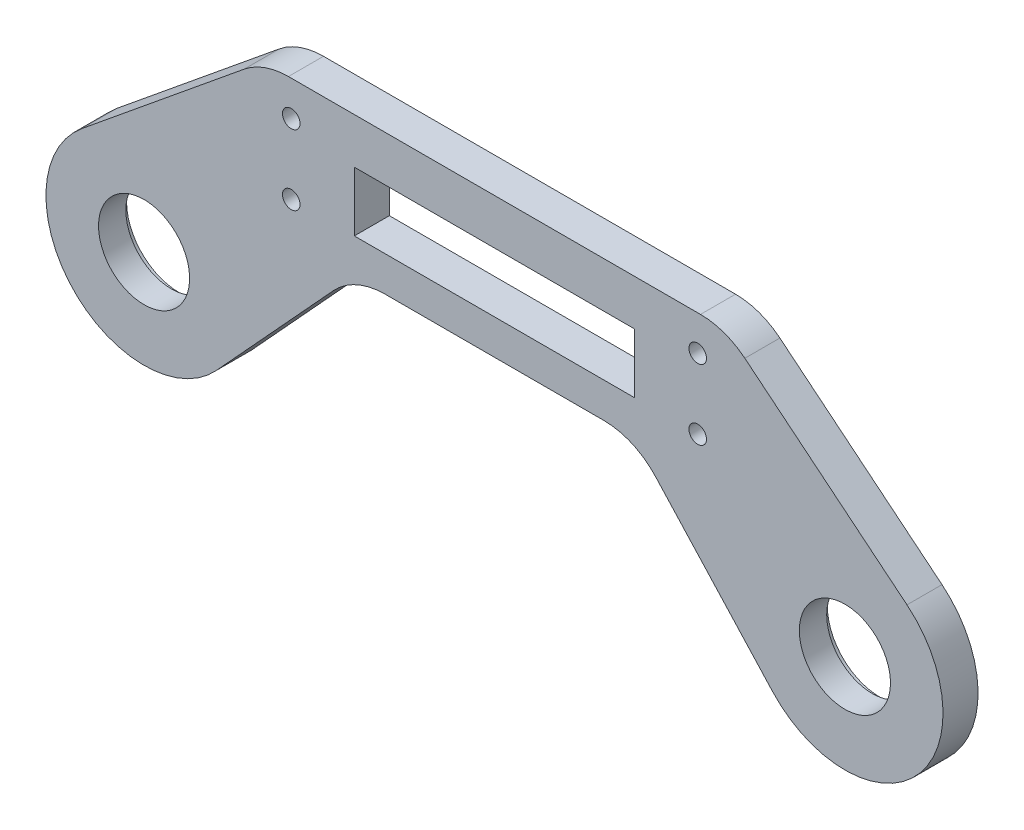
ISO-10303-21;
HEADER;
FILE_DESCRIPTION(('STEP AP214'),'2;1');
FILE_NAME('part.step','',(''),(''),'','','');
FILE_SCHEMA(('AUTOMOTIVE_DESIGN { 1 0 10303 214 1 1 1 1 }'));
ENDSEC;
DATA;
#1=APPLICATION_CONTEXT('core data for automotive mechanical design processes');
#2=APPLICATION_PROTOCOL_DEFINITION('international standard','automotive_design',2000,#1);
#3=PRODUCT_CONTEXT('',#1,'mechanical');
#4=PRODUCT('Part','Part','',(#3));
#5=PRODUCT_RELATED_PRODUCT_CATEGORY('part','',(#4));
#6=PRODUCT_DEFINITION_FORMATION('','',#4);
#7=PRODUCT_DEFINITION_CONTEXT('part definition',#1,'design');
#8=PRODUCT_DEFINITION('design','',#6,#7);
#9=PRODUCT_DEFINITION_SHAPE('','',#8);
#10=(LENGTH_UNIT() NAMED_UNIT(*) SI_UNIT(.MILLI.,.METRE.));
#11=(NAMED_UNIT(*) PLANE_ANGLE_UNIT() SI_UNIT($,.RADIAN.));
#12=(NAMED_UNIT(*) SI_UNIT($,.STERADIAN.) SOLID_ANGLE_UNIT());
#13=UNCERTAINTY_MEASURE_WITH_UNIT(LENGTH_MEASURE(1.E-05),#10,'distance_accuracy_value','');
#14=(GEOMETRIC_REPRESENTATION_CONTEXT(3) GLOBAL_UNCERTAINTY_ASSIGNED_CONTEXT((#13)) GLOBAL_UNIT_ASSIGNED_CONTEXT((#10,
#11,#12)) REPRESENTATION_CONTEXT('',''));
#15=CARTESIAN_POINT('',(0.,0.,0.));
#16=DIRECTION('',(0.,0.,1.));
#17=DIRECTION('',(1.,0.,0.));
#18=AXIS2_PLACEMENT_3D('',#15,#16,#17);
#19=CARTESIAN_POINT('',(-50.,-22.,5.));
#20=DIRECTION('',(0.,0.,-1.));
#21=DIRECTION('',(-1.,0.,0.));
#22=AXIS2_PLACEMENT_3D('',#19,#20,#21);
#23=CYLINDRICAL_SURFACE('',#22,6.5);
#24=CARTESIAN_POINT('',(-50.,-22.,5.));
#25=DIRECTION('',(0.,0.,-1.));
#26=DIRECTION('',(-1.,0.,0.));
#27=AXIS2_PLACEMENT_3D('',#24,#25,#26);
#28=CIRCLE('',#27,6.5);
#29=CARTESIAN_POINT('',(-56.5,-22.,5.));
#30=VERTEX_POINT('',#29);
#31=EDGE_CURVE('E285',#30,#30,#28,.T.);
#32=ORIENTED_EDGE('',*,*,#31,.F.);
#33=EDGE_LOOP('',(#32));
#34=FACE_BOUND('',#33,.T.);
#35=CARTESIAN_POINT('',(-50.,-22.,1.1));
#36=DIRECTION('',(0.,0.,-1.));
#37=DIRECTION('',(-1.,0.,0.));
#38=AXIS2_PLACEMENT_3D('',#35,#36,#37);
#39=CIRCLE('',#38,6.5);
#40=CARTESIAN_POINT('',(-56.5,-22.,1.1));
#41=VERTEX_POINT('',#40);
#42=EDGE_CURVE('E282',#41,#41,#39,.F.);
#43=ORIENTED_EDGE('',*,*,#42,.F.);
#44=EDGE_LOOP('',(#43));
#45=FACE_BOUND('',#44,.T.);
#46=ADVANCED_FACE('F36',(#34,#45),#23,.F.);
#47=CARTESIAN_POINT('',(50.,-22.,5.));
#48=DIRECTION('',(0.,0.,-1.));
#49=DIRECTION('',(-1.,0.,0.));
#50=AXIS2_PLACEMENT_3D('',#47,#48,#49);
#51=CYLINDRICAL_SURFACE('',#50,6.5);
#52=CARTESIAN_POINT('',(50.,-22.,5.));
#53=DIRECTION('',(0.,0.,-1.));
#54=DIRECTION('',(-1.,0.,0.));
#55=AXIS2_PLACEMENT_3D('',#52,#53,#54);
#56=CIRCLE('',#55,6.5);
#57=CARTESIAN_POINT('',(43.5,-22.,5.));
#58=VERTEX_POINT('',#57);
#59=EDGE_CURVE('E311',#58,#58,#56,.T.);
#60=ORIENTED_EDGE('',*,*,#59,.F.);
#61=EDGE_LOOP('',(#60));
#62=FACE_BOUND('',#61,.T.);
#63=CARTESIAN_POINT('',(50.,-22.,1.1));
#64=DIRECTION('',(0.,0.,-1.));
#65=DIRECTION('',(-1.,0.,0.));
#66=AXIS2_PLACEMENT_3D('',#63,#64,#65);
#67=CIRCLE('',#66,6.5);
#68=CARTESIAN_POINT('',(43.5,-22.,1.1));
#69=VERTEX_POINT('',#68);
#70=EDGE_CURVE('E279',#69,#69,#67,.F.);
#71=ORIENTED_EDGE('',*,*,#70,.F.);
#72=EDGE_LOOP('',(#71));
#73=FACE_BOUND('',#72,.T.);
#74=ADVANCED_FACE('F396',(#62,#73),#51,.F.);
#75=CARTESIAN_POINT('',(15.6021977856104,-20.,5.));
#76=DIRECTION('',(0.,0.,-1.));
#77=DIRECTION('',(-1.,0.,0.));
#78=AXIS2_PLACEMENT_3D('',#75,#76,#77);
#79=CYLINDRICAL_SURFACE('',#78,10.);
#80=CARTESIAN_POINT('',(15.6021977856104,-20.,0.));
#81=DIRECTION('',(0.,0.,-1.));
#82=DIRECTION('',(-1.,0.,0.));
#83=AXIS2_PLACEMENT_3D('',#80,#81,#82);
#84=CIRCLE('',#83,10.);
#85=CARTESIAN_POINT('',(15.6021977856103,-10.,0.));
#86=VERTEX_POINT('',#85);
#87=CARTESIAN_POINT('',(22.9723632519462,-13.241253000827,0.));
#88=VERTEX_POINT('',#87);
#89=EDGE_CURVE('E188',#86,#88,#84,.T.);
#90=ORIENTED_EDGE('',*,*,#89,.T.);
#91=DIRECTION('',(0.,0.,-1.));
#92=VECTOR('',#91,1.);
#93=CARTESIAN_POINT('',(22.9723632519462,-13.241253000827,5.));
#94=LINE('',#93,#92);
#95=CARTESIAN_POINT('',(22.9723632519462,-13.241253000827,5.));
#96=VERTEX_POINT('',#95);
#97=EDGE_CURVE('E11',#96,#88,#94,.T.);
#98=ORIENTED_EDGE('',*,*,#97,.F.);
#99=CARTESIAN_POINT('',(15.6021977856104,-20.,5.));
#100=DIRECTION('',(0.,0.,-1.));
#101=DIRECTION('',(-1.,0.,0.));
#102=AXIS2_PLACEMENT_3D('',#99,#100,#101);
#103=CIRCLE('',#102,10.);
#104=CARTESIAN_POINT('',(15.6021977856103,-10.,5.));
#105=VERTEX_POINT('',#104);
#106=EDGE_CURVE('E192',#105,#96,#103,.T.);
#107=ORIENTED_EDGE('',*,*,#106,.F.);
#108=DIRECTION('',(0.,0.,-1.));
#109=VECTOR('',#108,1.);
#110=CARTESIAN_POINT('',(15.6021977856103,-10.,5.));
#111=LINE('',#110,#109);
#112=EDGE_CURVE('E218',#105,#86,#111,.T.);
#113=ORIENTED_EDGE('',*,*,#112,.T.);
#114=EDGE_LOOP('',(#90,#98,#107,#113));
#115=FACE_BOUND('',#114,.T.);
#116=ADVANCED_FACE('F38',(#115),#79,.F.);
#117=CARTESIAN_POINT('',(22.9723632519462,-13.241253000827,5.));
#118=DIRECTION('',(0.737016546633586,0.675874699917302,0.));
#119=DIRECTION('',(-0.675874699917302,0.737016546633586,0.));
#120=AXIS2_PLACEMENT_3D('',#117,#118,#119);
#121=PLANE('',#120);
#122=DIRECTION('',(0.675874699917302,-0.737016546633586,0.));
#123=VECTOR('',#122,1.);
#124=CARTESIAN_POINT('',(22.9723632519462,-13.241253000827,0.));
#125=LINE('',#124,#123);
#126=CARTESIAN_POINT('',(39.6817683471298,-31.4622457988422,0.));
#127=VERTEX_POINT('',#126);
#128=EDGE_CURVE('E221',#88,#127,#125,.T.);
#129=ORIENTED_EDGE('',*,*,#128,.T.);
#130=DIRECTION('',(0.,0.,-1.));
#131=VECTOR('',#130,1.);
#132=CARTESIAN_POINT('',(39.6817683471298,-31.4622457988422,5.));
#133=LINE('',#132,#131);
#134=CARTESIAN_POINT('',(39.6817683471298,-31.4622457988422,5.));
#135=VERTEX_POINT('',#134);
#136=EDGE_CURVE('E45',#135,#127,#133,.T.);
#137=ORIENTED_EDGE('',*,*,#136,.F.);
#138=DIRECTION('',(0.675874699917302,-0.737016546633586,0.));
#139=VECTOR('',#138,1.);
#140=CARTESIAN_POINT('',(22.9723632519462,-13.241253000827,5.));
#141=LINE('',#140,#139);
#142=EDGE_CURVE('E195',#96,#135,#141,.T.);
#143=ORIENTED_EDGE('',*,*,#142,.F.);
#144=ORIENTED_EDGE('',*,*,#97,.T.);
#145=EDGE_LOOP('',(#129,#137,#143,#144));
#146=FACE_BOUND('',#145,.T.);
#147=ADVANCED_FACE('F338',(#146),#121,.F.);
#148=CARTESIAN_POINT('',(50.,-22.,5.));
#149=DIRECTION('',(0.,0.,-1.));
#150=DIRECTION('',(-1.,0.,0.));
#151=AXIS2_PLACEMENT_3D('',#148,#149,#150);
#152=CYLINDRICAL_SURFACE('',#151,14.);
#153=CARTESIAN_POINT('',(50.,-22.,0.));
#154=DIRECTION('',(0.,0.,1.));
#155=DIRECTION('',(1.,0.,0.));
#156=AXIS2_PLACEMENT_3D('',#153,#154,#155);
#157=CIRCLE('',#156,14.);
#158=CARTESIAN_POINT('',(58.8580242214528,-11.1586252305275,0.));
#159=VERTEX_POINT('',#158);
#160=EDGE_CURVE('E223',#127,#159,#157,.T.);
#161=ORIENTED_EDGE('',*,*,#160,.T.);
#162=DIRECTION('',(0.,0.,-1.));
#163=VECTOR('',#162,1.);
#164=CARTESIAN_POINT('',(58.8580242214528,-11.1586252305275,5.));
#165=LINE('',#164,#163);
#166=CARTESIAN_POINT('',(58.8580242214528,-11.1586252305275,5.));
#167=VERTEX_POINT('',#166);
#168=EDGE_CURVE('E268',#167,#159,#165,.T.);
#169=ORIENTED_EDGE('',*,*,#168,.F.);
#170=CARTESIAN_POINT('',(50.,-22.,5.));
#171=DIRECTION('',(0.,0.,1.));
#172=DIRECTION('',(1.,0.,0.));
#173=AXIS2_PLACEMENT_3D('',#170,#171,#172);
#174=CIRCLE('',#173,14.);
#175=EDGE_CURVE('E198',#135,#167,#174,.T.);
#176=ORIENTED_EDGE('',*,*,#175,.F.);
#177=ORIENTED_EDGE('',*,*,#136,.T.);
#178=EDGE_LOOP('',(#161,#169,#176,#177));
#179=FACE_BOUND('',#178,.T.);
#180=ADVANCED_FACE('F343',(#179),#152,.T.);
#181=CARTESIAN_POINT('',(35.723215038412,7.74383912105182,5.));
#182=DIRECTION('',(-0.63271601581806,-0.774383912105178,0.));
#183=DIRECTION('',(0.774383912105178,-0.63271601581806,0.));
#184=AXIS2_PLACEMENT_3D('',#181,#182,#183);
#185=PLANE('',#184);
#186=DIRECTION('',(-0.774383912105178,0.63271601581806,0.));
#187=VECTOR('',#186,1.);
#188=CARTESIAN_POINT('',(35.723215038412,7.74383912105182,0.));
#189=LINE('',#188,#187);
#190=CARTESIAN_POINT('',(35.723215038412,7.74383912105181,0.));
#191=VERTEX_POINT('',#190);
#192=EDGE_CURVE('E225',#159,#191,#189,.T.);
#193=ORIENTED_EDGE('',*,*,#192,.T.);
#194=DIRECTION('',(0.,0.,-1.));
#195=VECTOR('',#194,1.);
#196=CARTESIAN_POINT('',(35.723215038412,7.74383912105181,5.));
#197=LINE('',#196,#195);
#198=CARTESIAN_POINT('',(35.723215038412,7.74383912105181,5.));
#199=VERTEX_POINT('',#198);
#200=EDGE_CURVE('E265',#199,#191,#197,.T.);
#201=ORIENTED_EDGE('',*,*,#200,.F.);
#202=DIRECTION('',(-0.774383912105178,0.63271601581806,0.));
#203=VECTOR('',#202,1.);
#204=CARTESIAN_POINT('',(35.723215038412,7.74383912105182,5.));
#205=LINE('',#204,#203);
#206=EDGE_CURVE('E200',#167,#199,#205,.T.);
#207=ORIENTED_EDGE('',*,*,#206,.F.);
#208=ORIENTED_EDGE('',*,*,#168,.T.);
#209=EDGE_LOOP('',(#193,#201,#207,#208));
#210=FACE_BOUND('',#209,.T.);
#211=ADVANCED_FACE('F349',(#210),#185,.F.);
#212=CARTESIAN_POINT('',(29.3960548802314,0.,5.));
#213=DIRECTION('',(0.,0.,-1.));
#214=DIRECTION('',(-1.,0.,0.));
#215=AXIS2_PLACEMENT_3D('',#212,#213,#214);
#216=CYLINDRICAL_SURFACE('',#215,10.);
#217=CARTESIAN_POINT('',(29.3960548802314,0.,0.));
#218=DIRECTION('',(0.,0.,1.));
#219=DIRECTION('',(1.,0.,0.));
#220=AXIS2_PLACEMENT_3D('',#217,#218,#219);
#221=CIRCLE('',#220,10.);
#222=CARTESIAN_POINT('',(29.3960548802314,10.,0.));
#223=VERTEX_POINT('',#222);
#224=EDGE_CURVE('E227',#191,#223,#221,.T.);
#225=ORIENTED_EDGE('',*,*,#224,.T.);
#226=DIRECTION('',(0.,0.,-1.));
#227=VECTOR('',#226,1.);
#228=CARTESIAN_POINT('',(29.3960548802314,10.,5.));
#229=LINE('',#228,#227);
#230=CARTESIAN_POINT('',(29.3960548802314,10.,5.));
#231=VERTEX_POINT('',#230);
#232=EDGE_CURVE('E262',#231,#223,#229,.T.);
#233=ORIENTED_EDGE('',*,*,#232,.F.);
#234=CARTESIAN_POINT('',(29.3960548802314,0.,5.));
#235=DIRECTION('',(0.,0.,1.));
#236=DIRECTION('',(1.,0.,0.));
#237=AXIS2_PLACEMENT_3D('',#234,#235,#236);
#238=CIRCLE('',#237,10.);
#239=EDGE_CURVE('E202',#199,#231,#238,.T.);
#240=ORIENTED_EDGE('',*,*,#239,.F.);
#241=ORIENTED_EDGE('',*,*,#200,.T.);
#242=EDGE_LOOP('',(#225,#233,#240,#241));
#243=FACE_BOUND('',#242,.T.);
#244=ADVANCED_FACE('F353',(#243),#216,.T.);
#245=CARTESIAN_POINT('',(-29.3960548802314,10.,5.));
#246=DIRECTION('',(0.,-1.,0.));
#247=DIRECTION('',(1.,0.,0.));
#248=AXIS2_PLACEMENT_3D('',#245,#246,#247);
#249=PLANE('',#248);
#250=DIRECTION('',(-1.,0.,0.));
#251=VECTOR('',#250,1.);
#252=CARTESIAN_POINT('',(-29.3960548802314,10.,0.));
#253=LINE('',#252,#251);
#254=CARTESIAN_POINT('',(-29.3960548802314,10.,0.));
#255=VERTEX_POINT('',#254);
#256=EDGE_CURVE('E229',#223,#255,#253,.T.);
#257=ORIENTED_EDGE('',*,*,#256,.T.);
#258=DIRECTION('',(0.,0.,-1.));
#259=VECTOR('',#258,1.);
#260=CARTESIAN_POINT('',(-29.3960548802314,10.,5.));
#261=LINE('',#260,#259);
#262=CARTESIAN_POINT('',(-29.3960548802314,10.,5.));
#263=VERTEX_POINT('',#262);
#264=EDGE_CURVE('E259',#263,#255,#261,.T.);
#265=ORIENTED_EDGE('',*,*,#264,.F.);
#266=DIRECTION('',(-1.,0.,0.));
#267=VECTOR('',#266,1.);
#268=CARTESIAN_POINT('',(-29.3960548802314,10.,5.));
#269=LINE('',#268,#267);
#270=EDGE_CURVE('E204',#231,#263,#269,.T.);
#271=ORIENTED_EDGE('',*,*,#270,.F.);
#272=ORIENTED_EDGE('',*,*,#232,.T.);
#273=EDGE_LOOP('',(#257,#265,#271,#272));
#274=FACE_BOUND('',#273,.T.);
#275=ADVANCED_FACE('F358',(#274),#249,.F.);
#276=CARTESIAN_POINT('',(-29.3960548802314,0.,5.));
#277=DIRECTION('',(0.,0.,-1.));
#278=DIRECTION('',(-1.,0.,0.));
#279=AXIS2_PLACEMENT_3D('',#276,#277,#278);
#280=CYLINDRICAL_SURFACE('',#279,10.);
#281=CARTESIAN_POINT('',(-29.3960548802314,0.,0.));
#282=DIRECTION('',(0.,0.,1.));
#283=DIRECTION('',(1.,0.,0.));
#284=AXIS2_PLACEMENT_3D('',#281,#282,#283);
#285=CIRCLE('',#284,10.);
#286=CARTESIAN_POINT('',(-35.723215038412,7.74383912105178,0.));
#287=VERTEX_POINT('',#286);
#288=EDGE_CURVE('E231',#255,#287,#285,.T.);
#289=ORIENTED_EDGE('',*,*,#288,.T.);
#290=DIRECTION('',(0.,0.,-1.));
#291=VECTOR('',#290,1.);
#292=CARTESIAN_POINT('',(-35.723215038412,7.74383912105178,5.));
#293=LINE('',#292,#291);
#294=CARTESIAN_POINT('',(-35.723215038412,7.74383912105178,5.));
#295=VERTEX_POINT('',#294);
#296=EDGE_CURVE('E256',#295,#287,#293,.T.);
#297=ORIENTED_EDGE('',*,*,#296,.F.);
#298=CARTESIAN_POINT('',(-29.3960548802314,0.,5.));
#299=DIRECTION('',(0.,0.,1.));
#300=DIRECTION('',(1.,0.,0.));
#301=AXIS2_PLACEMENT_3D('',#298,#299,#300);
#302=CIRCLE('',#301,10.);
#303=EDGE_CURVE('E206',#263,#295,#302,.T.);
#304=ORIENTED_EDGE('',*,*,#303,.F.);
#305=ORIENTED_EDGE('',*,*,#264,.T.);
#306=EDGE_LOOP('',(#289,#297,#304,#305));
#307=FACE_BOUND('',#306,.T.);
#308=ADVANCED_FACE('F364',(#307),#280,.T.);
#309=CARTESIAN_POINT('',(-35.723215038412,7.74383912105178,5.));
#310=DIRECTION('',(0.63271601581806,-0.774383912105179,0.));
#311=DIRECTION('',(0.774383912105179,0.63271601581806,0.));
#312=AXIS2_PLACEMENT_3D('',#309,#310,#311);
#313=PLANE('',#312);
#314=DIRECTION('',(-0.774383912105179,-0.63271601581806,0.));
#315=VECTOR('',#314,1.);
#316=CARTESIAN_POINT('',(-35.723215038412,7.74383912105178,0.));
#317=LINE('',#316,#315);
#318=CARTESIAN_POINT('',(-58.8580242214528,-11.1586252305275,0.));
#319=VERTEX_POINT('',#318);
#320=EDGE_CURVE('E233',#287,#319,#317,.T.);
#321=ORIENTED_EDGE('',*,*,#320,.T.);
#322=DIRECTION('',(0.,0.,-1.));
#323=VECTOR('',#322,1.);
#324=CARTESIAN_POINT('',(-58.8580242214528,-11.1586252305275,5.));
#325=LINE('',#324,#323);
#326=CARTESIAN_POINT('',(-58.8580242214528,-11.1586252305275,5.));
#327=VERTEX_POINT('',#326);
#328=EDGE_CURVE('E253',#327,#319,#325,.T.);
#329=ORIENTED_EDGE('',*,*,#328,.F.);
#330=DIRECTION('',(-0.774383912105179,-0.63271601581806,0.));
#331=VECTOR('',#330,1.);
#332=CARTESIAN_POINT('',(-35.723215038412,7.74383912105178,5.));
#333=LINE('',#332,#331);
#334=EDGE_CURVE('E208',#295,#327,#333,.T.);
#335=ORIENTED_EDGE('',*,*,#334,.F.);
#336=ORIENTED_EDGE('',*,*,#296,.T.);
#337=EDGE_LOOP('',(#321,#329,#335,#336));
#338=FACE_BOUND('',#337,.T.);
#339=ADVANCED_FACE('F368',(#338),#313,.F.);
#340=CARTESIAN_POINT('',(-50.,-22.,5.));
#341=DIRECTION('',(0.,0.,-1.));
#342=DIRECTION('',(-1.,0.,0.));
#343=AXIS2_PLACEMENT_3D('',#340,#341,#342);
#344=CYLINDRICAL_SURFACE('',#343,14.);
#345=CARTESIAN_POINT('',(-50.,-22.,0.));
#346=DIRECTION('',(0.,0.,1.));
#347=DIRECTION('',(1.,0.,0.));
#348=AXIS2_PLACEMENT_3D('',#345,#346,#347);
#349=CIRCLE('',#348,14.);
#350=CARTESIAN_POINT('',(-39.6817683471298,-31.4622457988422,0.));
#351=VERTEX_POINT('',#350);
#352=EDGE_CURVE('E235',#319,#351,#349,.T.);
#353=ORIENTED_EDGE('',*,*,#352,.T.);
#354=DIRECTION('',(0.,0.,-1.));
#355=VECTOR('',#354,1.);
#356=CARTESIAN_POINT('',(-39.6817683471298,-31.4622457988422,5.));
#357=LINE('',#356,#355);
#358=CARTESIAN_POINT('',(-39.6817683471298,-31.4622457988422,5.));
#359=VERTEX_POINT('',#358);
#360=EDGE_CURVE('E250',#359,#351,#357,.T.);
#361=ORIENTED_EDGE('',*,*,#360,.F.);
#362=CARTESIAN_POINT('',(-50.,-22.,5.));
#363=DIRECTION('',(0.,0.,1.));
#364=DIRECTION('',(1.,0.,0.));
#365=AXIS2_PLACEMENT_3D('',#362,#363,#364);
#366=CIRCLE('',#365,14.);
#367=EDGE_CURVE('E210',#327,#359,#366,.T.);
#368=ORIENTED_EDGE('',*,*,#367,.F.);
#369=ORIENTED_EDGE('',*,*,#328,.T.);
#370=EDGE_LOOP('',(#353,#361,#368,#369));
#371=FACE_BOUND('',#370,.T.);
#372=ADVANCED_FACE('F373',(#371),#344,.T.);
#373=CARTESIAN_POINT('',(-22.9723632519463,-13.241253000827,5.));
#374=DIRECTION('',(-0.737016546633587,0.675874699917301,0.));
#375=DIRECTION('',(-0.675874699917301,-0.737016546633587,0.));
#376=AXIS2_PLACEMENT_3D('',#373,#374,#375);
#377=PLANE('',#376);
#378=DIRECTION('',(0.675874699917301,0.737016546633587,0.));
#379=VECTOR('',#378,1.);
#380=CARTESIAN_POINT('',(-22.9723632519463,-13.241253000827,0.));
#381=LINE('',#380,#379);
#382=CARTESIAN_POINT('',(-22.9723632519463,-13.241253000827,0.));
#383=VERTEX_POINT('',#382);
#384=EDGE_CURVE('E237',#351,#383,#381,.T.);
#385=ORIENTED_EDGE('',*,*,#384,.T.);
#386=DIRECTION('',(0.,0.,-1.));
#387=VECTOR('',#386,1.);
#388=CARTESIAN_POINT('',(-22.9723632519463,-13.241253000827,5.));
#389=LINE('',#388,#387);
#390=CARTESIAN_POINT('',(-22.9723632519463,-13.241253000827,5.));
#391=VERTEX_POINT('',#390);
#392=EDGE_CURVE('E247',#391,#383,#389,.T.);
#393=ORIENTED_EDGE('',*,*,#392,.F.);
#394=DIRECTION('',(0.675874699917301,0.737016546633587,0.));
#395=VECTOR('',#394,1.);
#396=CARTESIAN_POINT('',(-22.9723632519463,-13.241253000827,5.));
#397=LINE('',#396,#395);
#398=EDGE_CURVE('E212',#359,#391,#397,.T.);
#399=ORIENTED_EDGE('',*,*,#398,.F.);
#400=ORIENTED_EDGE('',*,*,#360,.T.);
#401=EDGE_LOOP('',(#385,#393,#399,#400));
#402=FACE_BOUND('',#401,.T.);
#403=ADVANCED_FACE('F379',(#402),#377,.F.);
#404=CARTESIAN_POINT('',(-15.6021977856104,-20.,5.));
#405=DIRECTION('',(0.,0.,-1.));
#406=DIRECTION('',(-1.,0.,0.));
#407=AXIS2_PLACEMENT_3D('',#404,#405,#406);
#408=CYLINDRICAL_SURFACE('',#407,10.);
#409=CARTESIAN_POINT('',(-15.6021977856104,-20.,0.));
#410=DIRECTION('',(0.,0.,-1.));
#411=DIRECTION('',(1.,0.,0.));
#412=AXIS2_PLACEMENT_3D('',#409,#410,#411);
#413=CIRCLE('',#412,10.);
#414=CARTESIAN_POINT('',(-15.6021977856103,-10.,0.));
#415=VERTEX_POINT('',#414);
#416=EDGE_CURVE('E239',#383,#415,#413,.T.);
#417=ORIENTED_EDGE('',*,*,#416,.T.);
#418=DIRECTION('',(0.,0.,-1.));
#419=VECTOR('',#418,1.);
#420=CARTESIAN_POINT('',(-15.6021977856103,-10.,5.));
#421=LINE('',#420,#419);
#422=CARTESIAN_POINT('',(-15.6021977856103,-10.,5.));
#423=VERTEX_POINT('',#422);
#424=EDGE_CURVE('E244',#423,#415,#421,.T.);
#425=ORIENTED_EDGE('',*,*,#424,.F.);
#426=CARTESIAN_POINT('',(-15.6021977856104,-20.,5.));
#427=DIRECTION('',(0.,0.,-1.));
#428=DIRECTION('',(1.,0.,0.));
#429=AXIS2_PLACEMENT_3D('',#426,#427,#428);
#430=CIRCLE('',#429,10.);
#431=EDGE_CURVE('E214',#391,#423,#430,.T.);
#432=ORIENTED_EDGE('',*,*,#431,.F.);
#433=ORIENTED_EDGE('',*,*,#392,.T.);
#434=EDGE_LOOP('',(#417,#425,#432,#433));
#435=FACE_BOUND('',#434,.T.);
#436=ADVANCED_FACE('F383',(#435),#408,.F.);
#437=CARTESIAN_POINT('',(-15.6021977856103,-10.,5.));
#438=DIRECTION('',(0.,1.,0.));
#439=DIRECTION('',(0.,0.,1.));
#440=AXIS2_PLACEMENT_3D('',#437,#438,#439);
#441=PLANE('',#440);
#442=DIRECTION('',(1.,0.,0.));
#443=VECTOR('',#442,1.);
#444=CARTESIAN_POINT('',(-15.6021977856103,-10.,0.));
#445=LINE('',#444,#443);
#446=EDGE_CURVE('E196',#415,#86,#445,.T.);
#447=ORIENTED_EDGE('',*,*,#446,.T.);
#448=ORIENTED_EDGE('',*,*,#112,.F.);
#449=DIRECTION('',(1.,0.,0.));
#450=VECTOR('',#449,1.);
#451=CARTESIAN_POINT('',(-15.6021977856103,-10.,5.));
#452=LINE('',#451,#450);
#453=EDGE_CURVE('E216',#423,#105,#452,.T.);
#454=ORIENTED_EDGE('',*,*,#453,.F.);
#455=ORIENTED_EDGE('',*,*,#424,.T.);
#456=EDGE_LOOP('',(#447,#448,#454,#455));
#457=FACE_BOUND('',#456,.T.);
#458=ADVANCED_FACE('F326',(#457),#441,.F.);
#459=CARTESIAN_POINT('',(15.6021977856104,-20.,5.));
#460=DIRECTION('',(0.,0.,-1.));
#461=DIRECTION('',(-1.,0.,0.));
#462=AXIS2_PLACEMENT_3D('',#459,#460,#461);
#463=PLANE('',#462);
#464=CARTESIAN_POINT('',(29.,-5.00000000000002,5.));
#465=DIRECTION('',(0.,0.,-1.));
#466=DIRECTION('',(-1.,0.,0.));
#467=AXIS2_PLACEMENT_3D('',#464,#465,#466);
#468=CIRCLE('',#467,1.25);
#469=CARTESIAN_POINT('',(27.75,-5.00000000000002,5.));
#470=VERTEX_POINT('',#469);
#471=EDGE_CURVE('E288',#470,#470,#468,.T.);
#472=ORIENTED_EDGE('',*,*,#471,.T.);
#473=EDGE_LOOP('',(#472));
#474=FACE_BOUND('',#473,.T.);
#475=CARTESIAN_POINT('',(29.,4.99999999999998,5.));
#476=DIRECTION('',(0.,0.,-1.));
#477=DIRECTION('',(-1.,0.,0.));
#478=AXIS2_PLACEMENT_3D('',#475,#476,#477);
#479=CIRCLE('',#478,1.25);
#480=CARTESIAN_POINT('',(27.75,4.99999999999998,5.));
#481=VERTEX_POINT('',#480);
#482=EDGE_CURVE('E294',#481,#481,#479,.T.);
#483=ORIENTED_EDGE('',*,*,#482,.T.);
#484=EDGE_LOOP('',(#483));
#485=FACE_BOUND('',#484,.T.);
#486=ORIENTED_EDGE('',*,*,#59,.T.);
#487=EDGE_LOOP('',(#486));
#488=FACE_BOUND('',#487,.T.);
#489=ORIENTED_EDGE('',*,*,#31,.T.);
#490=EDGE_LOOP('',(#489));
#491=FACE_BOUND('',#490,.T.);
#492=CARTESIAN_POINT('',(-29.,-5.00000000000002,5.));
#493=DIRECTION('',(0.,0.,1.));
#494=DIRECTION('',(1.,0.,0.));
#495=AXIS2_PLACEMENT_3D('',#492,#493,#494);
#496=CIRCLE('',#495,1.25);
#497=CARTESIAN_POINT('',(-27.75,-5.00000000000002,5.));
#498=VERTEX_POINT('',#497);
#499=EDGE_CURVE('E276',#498,#498,#496,.T.);
#500=ORIENTED_EDGE('',*,*,#499,.F.);
#501=EDGE_LOOP('',(#500));
#502=FACE_BOUND('',#501,.T.);
#503=CARTESIAN_POINT('',(-29.,4.99999999999998,5.));
#504=DIRECTION('',(0.,0.,1.));
#505=DIRECTION('',(1.,0.,0.));
#506=AXIS2_PLACEMENT_3D('',#503,#504,#505);
#507=CIRCLE('',#506,1.25);
#508=CARTESIAN_POINT('',(-27.75,4.99999999999998,5.));
#509=VERTEX_POINT('',#508);
#510=EDGE_CURVE('E175',#509,#509,#507,.T.);
#511=ORIENTED_EDGE('',*,*,#510,.F.);
#512=EDGE_LOOP('',(#511));
#513=FACE_BOUND('',#512,.T.);
#514=DIRECTION('',(1.,0.,0.));
#515=VECTOR('',#514,1.);
#516=CARTESIAN_POINT('',(-20.,-5.00000000000002,5.));
#517=LINE('',#516,#515);
#518=CARTESIAN_POINT('',(-20.,-5.00000000000001,5.));
#519=VERTEX_POINT('',#518);
#520=CARTESIAN_POINT('',(20.,-5.00000000000001,5.));
#521=VERTEX_POINT('',#520);
#522=EDGE_CURVE('E181',#519,#521,#517,.T.);
#523=ORIENTED_EDGE('',*,*,#522,.F.);
#524=DIRECTION('',(0.,-1.,0.));
#525=VECTOR('',#524,1.);
#526=CARTESIAN_POINT('',(-20.,-5.00000000000002,5.));
#527=LINE('',#526,#525);
#528=CARTESIAN_POINT('',(-20.,3.49999999999998,5.));
#529=VERTEX_POINT('',#528);
#530=EDGE_CURVE('E53',#529,#519,#527,.T.);
#531=ORIENTED_EDGE('',*,*,#530,.F.);
#532=DIRECTION('',(-1.,0.,0.));
#533=VECTOR('',#532,1.);
#534=CARTESIAN_POINT('',(-20.,3.49999999999998,5.));
#535=LINE('',#534,#533);
#536=CARTESIAN_POINT('',(20.,3.49999999999999,5.));
#537=VERTEX_POINT('',#536);
#538=EDGE_CURVE('E169',#537,#529,#535,.T.);
#539=ORIENTED_EDGE('',*,*,#538,.F.);
#540=DIRECTION('',(0.,1.,0.));
#541=VECTOR('',#540,1.);
#542=CARTESIAN_POINT('',(20.,-5.00000000000001,5.));
#543=LINE('',#542,#541);
#544=EDGE_CURVE('E172',#521,#537,#543,.T.);
#545=ORIENTED_EDGE('',*,*,#544,.F.);
#546=EDGE_LOOP('',(#523,#531,#539,#545));
#547=FACE_BOUND('',#546,.T.);
#548=ORIENTED_EDGE('',*,*,#106,.T.);
#549=ORIENTED_EDGE('',*,*,#142,.T.);
#550=ORIENTED_EDGE('',*,*,#175,.T.);
#551=ORIENTED_EDGE('',*,*,#206,.T.);
#552=ORIENTED_EDGE('',*,*,#239,.T.);
#553=ORIENTED_EDGE('',*,*,#270,.T.);
#554=ORIENTED_EDGE('',*,*,#303,.T.);
#555=ORIENTED_EDGE('',*,*,#334,.T.);
#556=ORIENTED_EDGE('',*,*,#367,.T.);
#557=ORIENTED_EDGE('',*,*,#398,.T.);
#558=ORIENTED_EDGE('',*,*,#431,.T.);
#559=ORIENTED_EDGE('',*,*,#453,.T.);
#560=EDGE_LOOP('',(#548,#549,#550,#551,#552,#553,#554,#555,#556,#557,#558,#559));
#561=FACE_BOUND('',#560,.T.);
#562=ADVANCED_FACE('F323',(#474,#485,#488,#491,#502,#513,#547,#561),#463,.F.);
#563=CARTESIAN_POINT('',(15.6021977856104,-20.,0.));
#564=DIRECTION('',(0.,0.,-1.));
#565=DIRECTION('',(-1.,0.,0.));
#566=AXIS2_PLACEMENT_3D('',#563,#564,#565);
#567=PLANE('',#566);
#568=CARTESIAN_POINT('',(29.,-5.00000000000002,0.));
#569=DIRECTION('',(0.,0.,-1.));
#570=DIRECTION('',(-1.,0.,0.));
#571=AXIS2_PLACEMENT_3D('',#568,#569,#570);
#572=CIRCLE('',#571,1.25);
#573=CARTESIAN_POINT('',(27.75,-5.00000000000002,0.));
#574=VERTEX_POINT('',#573);
#575=EDGE_CURVE('E40',#574,#574,#572,.F.);
#576=ORIENTED_EDGE('',*,*,#575,.T.);
#577=EDGE_LOOP('',(#576));
#578=FACE_BOUND('',#577,.T.);
#579=CARTESIAN_POINT('',(29.,4.99999999999998,0.));
#580=DIRECTION('',(0.,0.,-1.));
#581=DIRECTION('',(-1.,0.,0.));
#582=AXIS2_PLACEMENT_3D('',#579,#580,#581);
#583=CIRCLE('',#582,1.25);
#584=CARTESIAN_POINT('',(27.75,4.99999999999998,0.));
#585=VERTEX_POINT('',#584);
#586=EDGE_CURVE('E286',#585,#585,#583,.F.);
#587=ORIENTED_EDGE('',*,*,#586,.T.);
#588=EDGE_LOOP('',(#587));
#589=FACE_BOUND('',#588,.T.);
#590=CARTESIAN_POINT('',(50.,-22.,0.));
#591=DIRECTION('',(0.,0.,-1.));
#592=DIRECTION('',(-1.,0.,0.));
#593=AXIS2_PLACEMENT_3D('',#590,#591,#592);
#594=CIRCLE('',#593,7.5);
#595=CARTESIAN_POINT('',(42.5,-22.,0.));
#596=VERTEX_POINT('',#595);
#597=EDGE_CURVE('E303',#596,#596,#594,.T.);
#598=ORIENTED_EDGE('',*,*,#597,.F.);
#599=EDGE_LOOP('',(#598));
#600=FACE_BOUND('',#599,.T.);
#601=CARTESIAN_POINT('',(-50.,-22.,0.));
#602=DIRECTION('',(0.,0.,-1.));
#603=DIRECTION('',(-1.,0.,0.));
#604=AXIS2_PLACEMENT_3D('',#601,#602,#603);
#605=CIRCLE('',#604,7.5);
#606=CARTESIAN_POINT('',(-57.5,-22.,0.));
#607=VERTEX_POINT('',#606);
#608=EDGE_CURVE('E292',#607,#607,#605,.T.);
#609=ORIENTED_EDGE('',*,*,#608,.F.);
#610=EDGE_LOOP('',(#609));
#611=FACE_BOUND('',#610,.T.);
#612=CARTESIAN_POINT('',(-29.,-5.00000000000002,0.));
#613=DIRECTION('',(0.,0.,-1.));
#614=DIRECTION('',(-1.,0.,0.));
#615=AXIS2_PLACEMENT_3D('',#612,#613,#614);
#616=CIRCLE('',#615,1.25);
#617=CARTESIAN_POINT('',(-30.25,-5.00000000000002,0.));
#618=VERTEX_POINT('',#617);
#619=EDGE_CURVE('E182',#618,#618,#616,.T.);
#620=ORIENTED_EDGE('',*,*,#619,.F.);
#621=EDGE_LOOP('',(#620));
#622=FACE_BOUND('',#621,.T.);
#623=CARTESIAN_POINT('',(-29.,4.99999999999998,0.));
#624=DIRECTION('',(0.,0.,-1.));
#625=DIRECTION('',(-1.,0.,0.));
#626=AXIS2_PLACEMENT_3D('',#623,#624,#625);
#627=CIRCLE('',#626,1.25);
#628=CARTESIAN_POINT('',(-30.25,4.99999999999998,0.));
#629=VERTEX_POINT('',#628);
#630=EDGE_CURVE('E273',#629,#629,#627,.T.);
#631=ORIENTED_EDGE('',*,*,#630,.F.);
#632=EDGE_LOOP('',(#631));
#633=FACE_BOUND('',#632,.T.);
#634=DIRECTION('',(0.,-1.,0.));
#635=VECTOR('',#634,1.);
#636=CARTESIAN_POINT('',(-20.,-5.00000000000002,0.));
#637=LINE('',#636,#635);
#638=CARTESIAN_POINT('',(-20.,3.49999999999998,0.));
#639=VERTEX_POINT('',#638);
#640=CARTESIAN_POINT('',(-20.,-5.00000000000002,0.));
#641=VERTEX_POINT('',#640);
#642=EDGE_CURVE('E153',#639,#641,#637,.T.);
#643=ORIENTED_EDGE('',*,*,#642,.T.);
#644=DIRECTION('',(1.,0.,0.));
#645=VECTOR('',#644,1.);
#646=CARTESIAN_POINT('',(-20.,-5.00000000000002,0.));
#647=LINE('',#646,#645);
#648=CARTESIAN_POINT('',(20.,-5.00000000000001,0.));
#649=VERTEX_POINT('',#648);
#650=EDGE_CURVE('E162',#641,#649,#647,.T.);
#651=ORIENTED_EDGE('',*,*,#650,.T.);
#652=DIRECTION('',(0.,1.,0.));
#653=VECTOR('',#652,1.);
#654=CARTESIAN_POINT('',(20.,-5.00000000000001,0.));
#655=LINE('',#654,#653);
#656=CARTESIAN_POINT('',(20.,3.49999999999999,0.));
#657=VERTEX_POINT('',#656);
#658=EDGE_CURVE('E61',#649,#657,#655,.T.);
#659=ORIENTED_EDGE('',*,*,#658,.T.);
#660=DIRECTION('',(-1.,0.,0.));
#661=VECTOR('',#660,1.);
#662=CARTESIAN_POINT('',(-20.,3.49999999999998,0.));
#663=LINE('',#662,#661);
#664=EDGE_CURVE('E159',#657,#639,#663,.T.);
#665=ORIENTED_EDGE('',*,*,#664,.T.);
#666=EDGE_LOOP('',(#643,#651,#659,#665));
#667=FACE_BOUND('',#666,.T.);
#668=ORIENTED_EDGE('',*,*,#89,.F.);
#669=ORIENTED_EDGE('',*,*,#446,.F.);
#670=ORIENTED_EDGE('',*,*,#416,.F.);
#671=ORIENTED_EDGE('',*,*,#384,.F.);
#672=ORIENTED_EDGE('',*,*,#352,.F.);
#673=ORIENTED_EDGE('',*,*,#320,.F.);
#674=ORIENTED_EDGE('',*,*,#288,.F.);
#675=ORIENTED_EDGE('',*,*,#256,.F.);
#676=ORIENTED_EDGE('',*,*,#224,.F.);
#677=ORIENTED_EDGE('',*,*,#192,.F.);
#678=ORIENTED_EDGE('',*,*,#160,.F.);
#679=ORIENTED_EDGE('',*,*,#128,.F.);
#680=EDGE_LOOP('',(#668,#669,#670,#671,#672,#673,#674,#675,#676,#677,#678,#679));
#681=FACE_BOUND('',#680,.T.);
#682=ADVANCED_FACE('F166',(#578,#589,#600,#611,#622,#633,#667,#681),#567,.T.);
#683=CARTESIAN_POINT('',(-20.,-5.00000000000002,0.));
#684=DIRECTION('',(-1.,0.,0.));
#685=DIRECTION('',(0.,0.,1.));
#686=AXIS2_PLACEMENT_3D('',#683,#684,#685);
#687=PLANE('',#686);
#688=ORIENTED_EDGE('',*,*,#530,.T.);
#689=DIRECTION('',(0.,0.,1.));
#690=VECTOR('',#689,1.);
#691=CARTESIAN_POINT('',(-20.,-5.00000000000002,0.));
#692=LINE('',#691,#690);
#693=EDGE_CURVE('E149',#641,#519,#692,.T.);
#694=ORIENTED_EDGE('',*,*,#693,.F.);
#695=ORIENTED_EDGE('',*,*,#642,.F.);
#696=DIRECTION('',(0.,0.,1.));
#697=VECTOR('',#696,1.);
#698=CARTESIAN_POINT('',(-20.,3.49999999999998,0.));
#699=LINE('',#698,#697);
#700=EDGE_CURVE('E186',#639,#529,#699,.T.);
#701=ORIENTED_EDGE('',*,*,#700,.T.);
#702=EDGE_LOOP('',(#688,#694,#695,#701));
#703=FACE_BOUND('',#702,.T.);
#704=ADVANCED_FACE('F151',(#703),#687,.F.);
#705=CARTESIAN_POINT('',(-20.,3.49999999999998,0.));
#706=DIRECTION('',(0.,1.,0.));
#707=DIRECTION('',(-1.,0.,0.));
#708=AXIS2_PLACEMENT_3D('',#705,#706,#707);
#709=PLANE('',#708);
#710=ORIENTED_EDGE('',*,*,#538,.T.);
#711=ORIENTED_EDGE('',*,*,#700,.F.);
#712=ORIENTED_EDGE('',*,*,#664,.F.);
#713=DIRECTION('',(0.,0.,1.));
#714=VECTOR('',#713,1.);
#715=CARTESIAN_POINT('',(20.,3.49999999999999,0.));
#716=LINE('',#715,#714);
#717=EDGE_CURVE('E189',#657,#537,#716,.T.);
#718=ORIENTED_EDGE('',*,*,#717,.T.);
#719=EDGE_LOOP('',(#710,#711,#712,#718));
#720=FACE_BOUND('',#719,.T.);
#721=ADVANCED_FACE('F392',(#720),#709,.F.);
#722=CARTESIAN_POINT('',(20.,-5.00000000000001,0.));
#723=DIRECTION('',(1.,0.,0.));
#724=DIRECTION('',(0.,0.,-1.));
#725=AXIS2_PLACEMENT_3D('',#722,#723,#724);
#726=PLANE('',#725);
#727=ORIENTED_EDGE('',*,*,#544,.T.);
#728=ORIENTED_EDGE('',*,*,#717,.F.);
#729=ORIENTED_EDGE('',*,*,#658,.F.);
#730=DIRECTION('',(0.,0.,1.));
#731=VECTOR('',#730,1.);
#732=CARTESIAN_POINT('',(20.,-5.00000000000001,0.));
#733=LINE('',#732,#731);
#734=EDGE_CURVE('E158',#649,#521,#733,.T.);
#735=ORIENTED_EDGE('',*,*,#734,.T.);
#736=EDGE_LOOP('',(#727,#728,#729,#735));
#737=FACE_BOUND('',#736,.T.);
#738=ADVANCED_FACE('F418',(#737),#726,.F.);
#739=CARTESIAN_POINT('',(-20.,-5.00000000000002,0.));
#740=DIRECTION('',(0.,-1.,0.));
#741=DIRECTION('',(1.,0.,0.));
#742=AXIS2_PLACEMENT_3D('',#739,#740,#741);
#743=PLANE('',#742);
#744=ORIENTED_EDGE('',*,*,#522,.T.);
#745=ORIENTED_EDGE('',*,*,#734,.F.);
#746=ORIENTED_EDGE('',*,*,#650,.F.);
#747=ORIENTED_EDGE('',*,*,#693,.T.);
#748=EDGE_LOOP('',(#744,#745,#746,#747));
#749=FACE_BOUND('',#748,.T.);
#750=ADVANCED_FACE('F163',(#749),#743,.F.);
#751=CARTESIAN_POINT('',(-29.,4.99999999999998,-2.));
#752=DIRECTION('',(0.,0.,1.));
#753=DIRECTION('',(1.,0.,0.));
#754=AXIS2_PLACEMENT_3D('',#751,#752,#753);
#755=CYLINDRICAL_SURFACE('',#754,1.25);
#756=ORIENTED_EDGE('',*,*,#630,.T.);
#757=EDGE_LOOP('',(#756));
#758=FACE_BOUND('',#757,.T.);
#759=ORIENTED_EDGE('',*,*,#510,.T.);
#760=EDGE_LOOP('',(#759));
#761=FACE_BOUND('',#760,.T.);
#762=ADVANCED_FACE('F321',(#758,#761),#755,.F.);
#763=CARTESIAN_POINT('',(-29.,-5.00000000000002,-2.));
#764=DIRECTION('',(0.,0.,1.));
#765=DIRECTION('',(1.,0.,0.));
#766=AXIS2_PLACEMENT_3D('',#763,#764,#765);
#767=CYLINDRICAL_SURFACE('',#766,1.25);
#768=ORIENTED_EDGE('',*,*,#619,.T.);
#769=EDGE_LOOP('',(#768));
#770=FACE_BOUND('',#769,.T.);
#771=ORIENTED_EDGE('',*,*,#499,.T.);
#772=EDGE_LOOP('',(#771));
#773=FACE_BOUND('',#772,.T.);
#774=ADVANCED_FACE('F408',(#770,#773),#767,.F.);
#775=CARTESIAN_POINT('',(50.,-22.,1.1));
#776=DIRECTION('',(0.,0.,-1.));
#777=DIRECTION('',(-1.,0.,0.));
#778=AXIS2_PLACEMENT_3D('',#775,#776,#777);
#779=PLANE('',#778);
#780=CARTESIAN_POINT('',(50.,-22.,1.1));
#781=DIRECTION('',(0.,0.,-1.));
#782=DIRECTION('',(-1.,0.,0.));
#783=AXIS2_PLACEMENT_3D('',#780,#781,#782);
#784=CIRCLE('',#783,7.5);
#785=CARTESIAN_POINT('',(42.5,-22.,1.1));
#786=VERTEX_POINT('',#785);
#787=EDGE_CURVE('E283',#786,#786,#784,.T.);
#788=ORIENTED_EDGE('',*,*,#787,.T.);
#789=EDGE_LOOP('',(#788));
#790=FACE_BOUND('',#789,.T.);
#791=ORIENTED_EDGE('',*,*,#70,.T.);
#792=EDGE_LOOP('',(#791));
#793=FACE_BOUND('',#792,.T.);
#794=ADVANCED_FACE('F411',(#790,#793),#779,.T.);
#795=CARTESIAN_POINT('',(50.,-22.,1.1));
#796=DIRECTION('',(0.,0.,-1.));
#797=DIRECTION('',(-1.,0.,0.));
#798=AXIS2_PLACEMENT_3D('',#795,#796,#797);
#799=CYLINDRICAL_SURFACE('',#798,7.5);
#800=ORIENTED_EDGE('',*,*,#787,.F.);
#801=EDGE_LOOP('',(#800));
#802=FACE_BOUND('',#801,.T.);
#803=ORIENTED_EDGE('',*,*,#597,.T.);
#804=EDGE_LOOP('',(#803));
#805=FACE_BOUND('',#804,.T.);
#806=ADVANCED_FACE('F441',(#802,#805),#799,.F.);
#807=CARTESIAN_POINT('',(-50.,-22.,1.1));
#808=DIRECTION('',(0.,0.,-1.));
#809=DIRECTION('',(-1.,0.,0.));
#810=AXIS2_PLACEMENT_3D('',#807,#808,#809);
#811=PLANE('',#810);
#812=CARTESIAN_POINT('',(-50.,-22.,1.1));
#813=DIRECTION('',(0.,0.,-1.));
#814=DIRECTION('',(-1.,0.,0.));
#815=AXIS2_PLACEMENT_3D('',#812,#813,#814);
#816=CIRCLE('',#815,7.5);
#817=CARTESIAN_POINT('',(-57.5,-22.,1.1));
#818=VERTEX_POINT('',#817);
#819=EDGE_CURVE('E306',#818,#818,#816,.T.);
#820=ORIENTED_EDGE('',*,*,#819,.T.);
#821=EDGE_LOOP('',(#820));
#822=FACE_BOUND('',#821,.T.);
#823=ORIENTED_EDGE('',*,*,#42,.T.);
#824=EDGE_LOOP('',(#823));
#825=FACE_BOUND('',#824,.T.);
#826=ADVANCED_FACE('F450',(#822,#825),#811,.T.);
#827=CARTESIAN_POINT('',(-50.,-22.,1.1));
#828=DIRECTION('',(0.,0.,-1.));
#829=DIRECTION('',(-1.,0.,0.));
#830=AXIS2_PLACEMENT_3D('',#827,#828,#829);
#831=CYLINDRICAL_SURFACE('',#830,7.5);
#832=ORIENTED_EDGE('',*,*,#819,.F.);
#833=EDGE_LOOP('',(#832));
#834=FACE_BOUND('',#833,.T.);
#835=ORIENTED_EDGE('',*,*,#608,.T.);
#836=EDGE_LOOP('',(#835));
#837=FACE_BOUND('',#836,.T.);
#838=ADVANCED_FACE('F458',(#834,#837),#831,.F.);
#839=CARTESIAN_POINT('',(29.,4.99999999999998,-2.));
#840=DIRECTION('',(0.,0.,1.));
#841=DIRECTION('',(1.,0.,0.));
#842=AXIS2_PLACEMENT_3D('',#839,#840,#841);
#843=CYLINDRICAL_SURFACE('',#842,1.25);
#844=ORIENTED_EDGE('',*,*,#586,.F.);
#845=EDGE_LOOP('',(#844));
#846=FACE_BOUND('',#845,.T.);
#847=ORIENTED_EDGE('',*,*,#482,.F.);
#848=EDGE_LOOP('',(#847));
#849=FACE_BOUND('',#848,.T.);
#850=ADVANCED_FACE('F466',(#846,#849),#843,.F.);
#851=CARTESIAN_POINT('',(29.,-5.00000000000002,-2.));
#852=DIRECTION('',(0.,0.,1.));
#853=DIRECTION('',(1.,0.,0.));
#854=AXIS2_PLACEMENT_3D('',#851,#852,#853);
#855=CYLINDRICAL_SURFACE('',#854,1.25);
#856=ORIENTED_EDGE('',*,*,#575,.F.);
#857=EDGE_LOOP('',(#856));
#858=FACE_BOUND('',#857,.T.);
#859=ORIENTED_EDGE('',*,*,#471,.F.);
#860=EDGE_LOOP('',(#859));
#861=FACE_BOUND('',#860,.T.);
#862=ADVANCED_FACE('F474',(#858,#861),#855,.F.);
#863=CLOSED_SHELL('',(#46,#74,#116,#147,#180,#211,#244,#275,#308,#339,#372,#403,#436,#458,#562,
#682,#704,#721,#738,#750,#762,#774,#794,#806,#826,#838,#850,#862));
#864=MANIFOLD_SOLID_BREP('B2',#863);
#865=ADVANCED_BREP_SHAPE_REPRESENTATION('',(#18,#864),#14);
#866=SHAPE_DEFINITION_REPRESENTATION(#9,#865);
ENDSEC;
END-ISO-10303-21;
